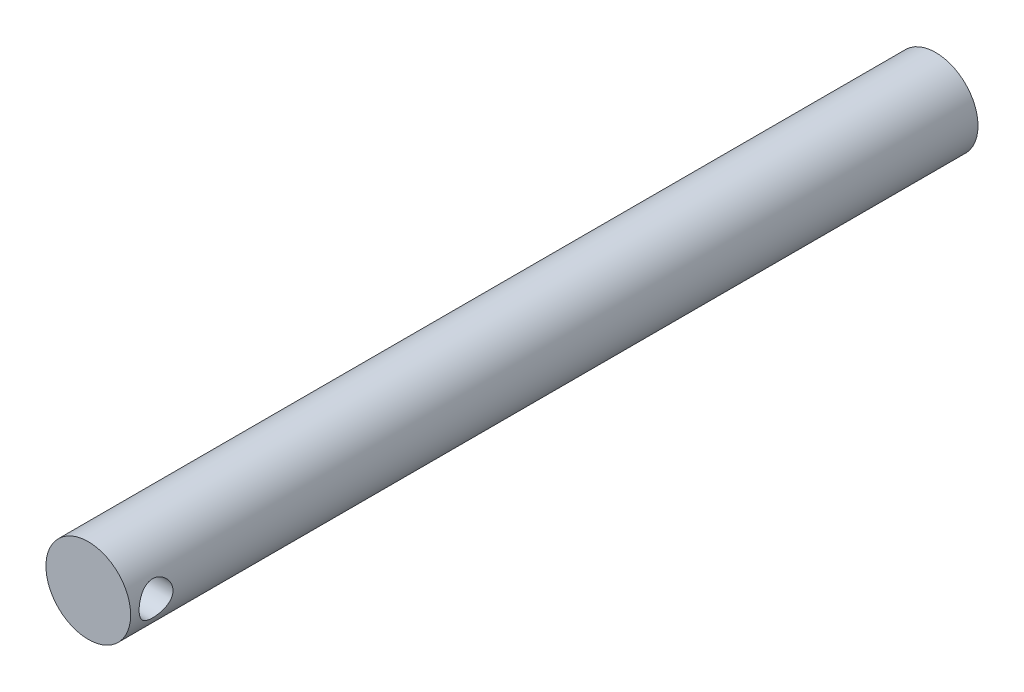
ISO-10303-21;
HEADER;
FILE_DESCRIPTION(('STEP AP214'),'2;1');
FILE_NAME('part.step','',(''),(''),'','','');
FILE_SCHEMA(('AUTOMOTIVE_DESIGN { 1 0 10303 214 1 1 1 1 }'));
ENDSEC;
DATA;
#1=APPLICATION_CONTEXT('core data for automotive mechanical design processes');
#2=APPLICATION_PROTOCOL_DEFINITION('international standard','automotive_design',2000,#1);
#3=PRODUCT_CONTEXT('',#1,'mechanical');
#4=PRODUCT('Part','Part','',(#3));
#5=PRODUCT_RELATED_PRODUCT_CATEGORY('part','',(#4));
#6=PRODUCT_DEFINITION_FORMATION('','',#4);
#7=PRODUCT_DEFINITION_CONTEXT('part definition',#1,'design');
#8=PRODUCT_DEFINITION('design','',#6,#7);
#9=PRODUCT_DEFINITION_SHAPE('','',#8);
#10=(LENGTH_UNIT() NAMED_UNIT(*) SI_UNIT(.MILLI.,.METRE.));
#11=(NAMED_UNIT(*) PLANE_ANGLE_UNIT() SI_UNIT($,.RADIAN.));
#12=(NAMED_UNIT(*) SI_UNIT($,.STERADIAN.) SOLID_ANGLE_UNIT());
#13=UNCERTAINTY_MEASURE_WITH_UNIT(LENGTH_MEASURE(1.E-05),#10,'distance_accuracy_value','');
#14=(GEOMETRIC_REPRESENTATION_CONTEXT(3) GLOBAL_UNCERTAINTY_ASSIGNED_CONTEXT((#13)) GLOBAL_UNIT_ASSIGNED_CONTEXT((#10,
#11,#12)) REPRESENTATION_CONTEXT('',''));
#15=CARTESIAN_POINT('',(0.,0.,0.));
#16=DIRECTION('',(0.,0.,1.));
#17=DIRECTION('',(1.,0.,0.));
#18=AXIS2_PLACEMENT_3D('',#15,#16,#17);
#19=CARTESIAN_POINT('',(0.,0.,50.));
#20=DIRECTION('',(0.,0.,-1.));
#21=DIRECTION('',(-1.,0.,0.));
#22=AXIS2_PLACEMENT_3D('',#19,#20,#21);
#23=CYLINDRICAL_SURFACE('',#22,2.5);
#24=CARTESIAN_POINT('',(-2.5,0.,47.5));
#25=CARTESIAN_POINT('',(-2.49999635613542,0.0537465027214451,47.5000049259119));
#26=CARTESIAN_POINT('',(-2.49824647153466,0.107586282045336,47.5043588760442));
#27=CARTESIAN_POINT('',(-2.49141726550321,0.213748240208947,47.5216238517606));
#28=CARTESIAN_POINT('',(-2.48632889349439,0.266065888780623,47.5345581395431));
#29=CARTESIAN_POINT('',(-2.47337104606559,0.367476961363701,47.5684380390294));
#30=CARTESIAN_POINT('',(-2.46551068182036,0.416580330808481,47.5893574231084));
#31=CARTESIAN_POINT('',(-2.44778305398039,0.510535985164186,47.6385095866633));
#32=CARTESIAN_POINT('',(-2.43791648729028,0.555389738375498,47.6667398274595));
#33=CARTESIAN_POINT('',(-2.41665443085209,0.641750503785198,47.7311177492805));
#34=CARTESIAN_POINT('',(-2.40521148464595,0.683031136275108,47.7675533281201));
#35=CARTESIAN_POINT('',(-2.38230288453097,0.759087502392362,47.8467000017384));
#36=CARTESIAN_POINT('',(-2.37083722226896,0.793860053566767,47.8894141486059));
#37=CARTESIAN_POINT('',(-2.34861395898568,0.85743728364644,47.9822140351211));
#38=CARTESIAN_POINT('',(-2.33791057982476,0.885907490597737,48.0325432430116));
#39=CARTESIAN_POINT('',(-2.31916823593396,0.933877359518574,48.13776819921));
#40=CARTESIAN_POINT('',(-2.31112800622088,0.953381282142916,48.1926617639242));
#41=CARTESIAN_POINT('',(-2.29913178830409,0.981949411697932,48.3028561667961));
#42=CARTESIAN_POINT('',(-2.29500710177802,0.991446982902822,48.3580256177881));
#43=CARTESIAN_POINT('',(-2.29082002024572,1.00108648082001,48.4693174991536));
#44=CARTESIAN_POINT('',(-2.29075562761384,1.00123300815661,48.5254394473125));
#45=CARTESIAN_POINT('',(-2.29455250139997,0.99249468375227,48.632878335729));
#46=CARTESIAN_POINT('',(-2.29814087519225,0.984237657152566,48.6842578572045));
#47=CARTESIAN_POINT('',(-2.30838093803918,0.959973440148907,48.7848297780034));
#48=CARTESIAN_POINT('',(-2.31503316160837,0.943964897402312,48.8340217940552));
#49=CARTESIAN_POINT('',(-2.33079742544265,0.904347366275535,48.930008918098));
#50=CARTESIAN_POINT('',(-2.33995689640394,0.880589931157658,48.9767346195273));
#51=CARTESIAN_POINT('',(-2.35969058194945,0.826253230366107,49.0657079081808));
#52=CARTESIAN_POINT('',(-2.37026532728424,0.795671402550422,49.1079538047014));
#53=CARTESIAN_POINT('',(-2.39263368371135,0.725775299727216,49.190204864401));
#54=CARTESIAN_POINT('',(-2.40445832488076,0.685968731485316,49.229784364723));
#55=CARTESIAN_POINT('',(-2.42729912479141,0.600157213715093,49.301842239001));
#56=CARTESIAN_POINT('',(-2.43831512222662,0.554151032667212,49.3343191987051));
#57=CARTESIAN_POINT('',(-2.45857340632274,0.456038826302915,49.3918087237079));
#58=CARTESIAN_POINT('',(-2.46777635047707,0.403830245673232,49.4166611405985));
#59=CARTESIAN_POINT('',(-2.48307414164379,0.295511882741435,49.457083930539));
#60=CARTESIAN_POINT('',(-2.48917056731191,0.239404098424833,49.4726590187787));
#61=CARTESIAN_POINT('',(-2.49728069753455,0.128447943803907,49.4932241477099));
#62=CARTESIAN_POINT('',(-2.49951472916757,0.0737216469927646,49.4987862271268));
#63=CARTESIAN_POINT('',(-2.50034239255315,-0.0359226549039106,49.5008565502643));
#64=CARTESIAN_POINT('',(-2.49893696791146,-0.0908406066119634,49.4973671407738));
#65=CARTESIAN_POINT('',(-2.49278783531876,-0.196716369560996,49.481854123724));
#66=CARTESIAN_POINT('',(-2.48819695672762,-0.24774124588774,49.4702210098245));
#67=CARTESIAN_POINT('',(-2.4762972070275,-0.347067714030392,49.4392821458451));
#68=CARTESIAN_POINT('',(-2.46898798678265,-0.395368955112423,49.4199754101657));
#69=CARTESIAN_POINT('',(-2.45208297385406,-0.489539392908351,49.37360753016));
#70=CARTESIAN_POINT('',(-2.44242407989902,-0.535289011377704,49.3463272639784));
#71=CARTESIAN_POINT('',(-2.42186682372762,-0.621721795623279,49.2850298380472));
#72=CARTESIAN_POINT('',(-2.41096796555135,-0.662402920380563,49.2510099785387));
#73=CARTESIAN_POINT('',(-2.38822558819056,-0.740361521514408,49.1745649935252));
#74=CARTESIAN_POINT('',(-2.37636720712526,-0.777236966903029,49.1317332292469));
#75=CARTESIAN_POINT('',(-2.35370836458566,-0.843375598706853,49.0402799584953));
#76=CARTESIAN_POINT('',(-2.34290807763255,-0.872637530668753,48.99165749983));
#77=CARTESIAN_POINT('',(-2.32357149953854,-0.922903750965812,48.8892691527029));
#78=CARTESIAN_POINT('',(-2.31505815442394,-0.943825297267224,48.8354580003938));
#79=CARTESIAN_POINT('',(-2.30161836738966,-0.976148109852649,48.7246331741424));
#80=CARTESIAN_POINT('',(-2.29668927847999,-0.987556402634655,48.6676218970938));
#81=CARTESIAN_POINT('',(-2.29135879649963,-0.999857808639198,48.5564360491127));
#82=CARTESIAN_POINT('',(-2.29065710504086,-1.00144854115143,48.5023525802033));
#83=CARTESIAN_POINT('',(-2.29307418016549,-0.995901579638761,48.3947275711434));
#84=CARTESIAN_POINT('',(-2.29619246162397,-0.98876499395689,48.3411859630487));
#85=CARTESIAN_POINT('',(-2.3056332453951,-0.966535683076823,48.2383339050725));
#86=CARTESIAN_POINT('',(-2.31182415913725,-0.951768746785487,48.1889398627835));
#87=CARTESIAN_POINT('',(-2.32662000616348,-0.915002724245505,48.0933106851933));
#88=CARTESIAN_POINT('',(-2.33522560603003,-0.893001640696907,48.0470764265501));
#89=CARTESIAN_POINT('',(-2.35449304802246,-0.840936381379867,47.9561951903646));
#90=CARTESIAN_POINT('',(-2.36524441156621,-0.810482667579747,47.9117906649348));
#91=CARTESIAN_POINT('',(-2.38731902186119,-0.74294605963575,47.8285033413981));
#92=CARTESIAN_POINT('',(-2.39864244024203,-0.705861167409062,47.7896222139358));
#93=CARTESIAN_POINT('',(-2.42146783543697,-0.623252753136232,47.7158985733682));
#94=CARTESIAN_POINT('',(-2.43293378981093,-0.577338000573069,47.681481346551));
#95=CARTESIAN_POINT('',(-2.45400203356858,-0.47995016014289,47.6208314786892));
#96=CARTESIAN_POINT('',(-2.46360345546453,-0.428474502273619,47.5946026439237));
#97=CARTESIAN_POINT('',(-2.47969857407931,-0.322369031247602,47.5516888924049));
#98=CARTESIAN_POINT('',(-2.48624681527514,-0.267815809109847,47.5348353382198));
#99=CARTESIAN_POINT('',(-2.49572153104683,-0.156438273140609,47.5106804395229));
#100=CARTESIAN_POINT('',(-2.49865949747819,-0.0996217629294543,47.5033487816281));
#101=CARTESIAN_POINT('',(-2.49987949752068,-0.0284561489454632,47.5003023095109));
#102=CARTESIAN_POINT('',(-2.50000096484588,-0.0142313443703784,47.4999986956854));
#103=CARTESIAN_POINT('',(-2.5,0.,47.5));
#104=B_SPLINE_CURVE_WITH_KNOTS('',3,(#24,#25,#26,#27,#28,#29,#30,#31,#32,#33,#34,#35,#36,#37,
#38,#39,#40,#41,#42,#43,#44,#45,#46,#47,#48,#49,#50,#51,#52,#53,#54,#55,#56,#57,#58,#59,#60,#61,
#62,#63,#64,#65,#66,#67,#68,#69,#70,#71,#72,#73,#74,#75,#76,#77,#78,#79,#80,#81,#82,#83,#84,#85,
#86,#87,#88,#89,#90,#91,#92,#93,#94,#95,#96,#97,#98,#99,#100,#101,#102,#103),.UNSPECIFIED.,.T.,
.F.,(4,2,2,2,2,2,2,2,2,2,2,2,2,2,2,2,2,2,2,2,2,2,2,2,2,2,2,2,2,2,2,2,2,2,2,2,2,2,2,4),(0.,
0.161201493946534,0.322841818003967,0.483955728735792,0.645013767839921,0.812986908501987,
0.981041974672062,1.15657629409609,1.33202711559134,1.49952052654414,1.66693153170244,
1.82269164200686,1.97847893628023,2.13744563149407,2.29647210969091,2.46779174593278,
2.63914546419866,2.81388456581403,2.98853478056895,3.15284592264003,3.31711446785041,
3.47400227782182,3.63091024496898,3.79261756699131,3.95438979749484,4.12684237312205,
4.29932334521874,4.47347522570412,4.64749836322966,4.80899836696373,4.97047786281521,
5.12557159274383,5.2807081790258,5.44472734028344,5.60879600674195,5.78350211766916,
5.95828931820265,6.12982150506658,6.3008062620217,6.34349022948396),.UNSPECIFIED.);
#105=CARTESIAN_POINT('',(-2.5,0.,47.5));
#106=VERTEX_POINT('',#105);
#107=EDGE_CURVE('E10',#106,#106,#104,.T.);
#108=ORIENTED_EDGE('',*,*,#107,.T.);
#109=EDGE_LOOP('',(#108));
#110=FACE_BOUND('',#109,.T.);
#111=CARTESIAN_POINT('',(2.5,0.,47.5));
#112=CARTESIAN_POINT('',(2.49999635613542,-0.0537465027214451,47.5000049259119));
#113=CARTESIAN_POINT('',(2.49824647153466,-0.107586282045336,47.5043588760442));
#114=CARTESIAN_POINT('',(2.49141726550321,-0.213748240208947,47.5216238517606));
#115=CARTESIAN_POINT('',(2.48632889349439,-0.266065888780623,47.5345581395431));
#116=CARTESIAN_POINT('',(2.47337104606559,-0.367476961363701,47.5684380390294));
#117=CARTESIAN_POINT('',(2.46551068182036,-0.416580330808481,47.5893574231084));
#118=CARTESIAN_POINT('',(2.44778305398039,-0.510535985164186,47.6385095866633));
#119=CARTESIAN_POINT('',(2.43791648729028,-0.555389738375498,47.6667398274595));
#120=CARTESIAN_POINT('',(2.41665443085209,-0.641750503785198,47.7311177492805));
#121=CARTESIAN_POINT('',(2.40521148464595,-0.683031136275108,47.7675533281201));
#122=CARTESIAN_POINT('',(2.38230288453097,-0.759087502392362,47.8467000017384));
#123=CARTESIAN_POINT('',(2.37083722226896,-0.793860053566767,47.8894141486059));
#124=CARTESIAN_POINT('',(2.34861395898568,-0.85743728364644,47.9822140351211));
#125=CARTESIAN_POINT('',(2.33791057982476,-0.885907490597737,48.0325432430116));
#126=CARTESIAN_POINT('',(2.31916823593396,-0.933877359518574,48.13776819921));
#127=CARTESIAN_POINT('',(2.31112800622088,-0.953381282142916,48.1926617639242));
#128=CARTESIAN_POINT('',(2.29913178830409,-0.981949411697932,48.3028561667961));
#129=CARTESIAN_POINT('',(2.29500710177802,-0.991446982902822,48.3580256177881));
#130=CARTESIAN_POINT('',(2.29082002024572,-1.00108648082001,48.4693174991536));
#131=CARTESIAN_POINT('',(2.29075562761384,-1.00123300815661,48.5254394473125));
#132=CARTESIAN_POINT('',(2.29455250139997,-0.99249468375227,48.632878335729));
#133=CARTESIAN_POINT('',(2.29814087519225,-0.984237657152566,48.6842578572045));
#134=CARTESIAN_POINT('',(2.30838093803918,-0.959973440148907,48.7848297780034));
#135=CARTESIAN_POINT('',(2.31503316160837,-0.943964897402312,48.8340217940552));
#136=CARTESIAN_POINT('',(2.33079742544265,-0.904347366275535,48.930008918098));
#137=CARTESIAN_POINT('',(2.33995689640394,-0.880589931157658,48.9767346195273));
#138=CARTESIAN_POINT('',(2.35969058194945,-0.826253230366107,49.0657079081808));
#139=CARTESIAN_POINT('',(2.37026532728424,-0.795671402550422,49.1079538047014));
#140=CARTESIAN_POINT('',(2.39263368371135,-0.725775299727216,49.190204864401));
#141=CARTESIAN_POINT('',(2.40445832488076,-0.685968731485316,49.229784364723));
#142=CARTESIAN_POINT('',(2.42729912479141,-0.600157213715093,49.301842239001));
#143=CARTESIAN_POINT('',(2.43831512222662,-0.554151032667212,49.3343191987051));
#144=CARTESIAN_POINT('',(2.45857340632274,-0.456038826302915,49.3918087237079));
#145=CARTESIAN_POINT('',(2.46777635047707,-0.403830245673232,49.4166611405985));
#146=CARTESIAN_POINT('',(2.48307414164379,-0.295511882741435,49.457083930539));
#147=CARTESIAN_POINT('',(2.48917056731191,-0.239404098424833,49.4726590187787));
#148=CARTESIAN_POINT('',(2.49728069753455,-0.128447943803907,49.4932241477099));
#149=CARTESIAN_POINT('',(2.49951472916757,-0.0737216469927646,49.4987862271268));
#150=CARTESIAN_POINT('',(2.50034239255315,0.0359226549039106,49.5008565502643));
#151=CARTESIAN_POINT('',(2.49893696791146,0.0908406066119634,49.4973671407738));
#152=CARTESIAN_POINT('',(2.49278783531876,0.196716369560996,49.481854123724));
#153=CARTESIAN_POINT('',(2.48819695672762,0.24774124588774,49.4702210098245));
#154=CARTESIAN_POINT('',(2.4762972070275,0.347067714030392,49.4392821458451));
#155=CARTESIAN_POINT('',(2.46898798678265,0.395368955112423,49.4199754101657));
#156=CARTESIAN_POINT('',(2.45208297385406,0.489539392908351,49.37360753016));
#157=CARTESIAN_POINT('',(2.44242407989902,0.535289011377704,49.3463272639784));
#158=CARTESIAN_POINT('',(2.42186682372762,0.621721795623279,49.2850298380472));
#159=CARTESIAN_POINT('',(2.41096796555135,0.662402920380563,49.2510099785387));
#160=CARTESIAN_POINT('',(2.38822558819056,0.740361521514408,49.1745649935252));
#161=CARTESIAN_POINT('',(2.37636720712526,0.777236966903029,49.1317332292469));
#162=CARTESIAN_POINT('',(2.35370836458566,0.843375598706853,49.0402799584953));
#163=CARTESIAN_POINT('',(2.34290807763255,0.872637530668753,48.99165749983));
#164=CARTESIAN_POINT('',(2.32357149953854,0.922903750965812,48.8892691527029));
#165=CARTESIAN_POINT('',(2.31505815442394,0.943825297267224,48.8354580003938));
#166=CARTESIAN_POINT('',(2.30161836738966,0.976148109852649,48.7246331741424));
#167=CARTESIAN_POINT('',(2.29668927847999,0.987556402634655,48.6676218970938));
#168=CARTESIAN_POINT('',(2.29135879649963,0.999857808639198,48.5564360491127));
#169=CARTESIAN_POINT('',(2.29065710504086,1.00144854115143,48.5023525802033));
#170=CARTESIAN_POINT('',(2.29307418016549,0.995901579638761,48.3947275711434));
#171=CARTESIAN_POINT('',(2.29619246162397,0.98876499395689,48.3411859630487));
#172=CARTESIAN_POINT('',(2.3056332453951,0.966535683076823,48.2383339050725));
#173=CARTESIAN_POINT('',(2.31182415913725,0.951768746785487,48.1889398627835));
#174=CARTESIAN_POINT('',(2.32662000616348,0.915002724245505,48.0933106851933));
#175=CARTESIAN_POINT('',(2.33522560603003,0.893001640696907,48.0470764265501));
#176=CARTESIAN_POINT('',(2.35449304802246,0.840936381379867,47.9561951903646));
#177=CARTESIAN_POINT('',(2.36524441156621,0.810482667579747,47.9117906649348));
#178=CARTESIAN_POINT('',(2.38731902186119,0.74294605963575,47.8285033413981));
#179=CARTESIAN_POINT('',(2.39864244024203,0.705861167409062,47.7896222139358));
#180=CARTESIAN_POINT('',(2.42146783543697,0.623252753136232,47.7158985733682));
#181=CARTESIAN_POINT('',(2.43293378981093,0.577338000573069,47.681481346551));
#182=CARTESIAN_POINT('',(2.45400203356858,0.47995016014289,47.6208314786892));
#183=CARTESIAN_POINT('',(2.46360345546453,0.428474502273619,47.5946026439237));
#184=CARTESIAN_POINT('',(2.47969857407931,0.322369031247602,47.5516888924049));
#185=CARTESIAN_POINT('',(2.48624681527514,0.267815809109847,47.5348353382198));
#186=CARTESIAN_POINT('',(2.49572153104683,0.156438273140609,47.5106804395229));
#187=CARTESIAN_POINT('',(2.49865949747819,0.0996217629294543,47.5033487816281));
#188=CARTESIAN_POINT('',(2.49987949752068,0.0284561489454632,47.5003023095109));
#189=CARTESIAN_POINT('',(2.50000096484588,0.0142313443703784,47.4999986956854));
#190=CARTESIAN_POINT('',(2.5,0.,47.5));
#191=B_SPLINE_CURVE_WITH_KNOTS('',3,(#111,#112,#113,#114,#115,#116,#117,#118,#119,#120,#121,
#122,#123,#124,#125,#126,#127,#128,#129,#130,#131,#132,#133,#134,#135,#136,#137,#138,#139,#140,
#141,#142,#143,#144,#145,#146,#147,#148,#149,#150,#151,#152,#153,#154,#155,#156,#157,#158,#159,
#160,#161,#162,#163,#164,#165,#166,#167,#168,#169,#170,#171,#172,#173,#174,#175,#176,#177,#178,
#179,#180,#181,#182,#183,#184,#185,#186,#187,#188,#189,#190),.UNSPECIFIED.,.T.,.F.,(4,2,2,2,2,2,
2,2,2,2,2,2,2,2,2,2,2,2,2,2,2,2,2,2,2,2,2,2,2,2,2,2,2,2,2,2,2,2,2,4),(0.,0.161201493946534,
0.322841818003967,0.483955728735792,0.645013767839921,0.812986908501987,0.981041974672062,
1.15657629409609,1.33202711559134,1.49952052654414,1.66693153170244,1.82269164200686,
1.97847893628023,2.13744563149407,2.29647210969091,2.46779174593278,2.63914546419866,
2.81388456581403,2.98853478056895,3.15284592264003,3.31711446785041,3.47400227782182,
3.63091024496898,3.79261756699131,3.95438979749484,4.12684237312205,4.29932334521874,
4.47347522570412,4.64749836322966,4.80899836696373,4.97047786281521,5.12557159274383,
5.2807081790258,5.44472734028344,5.60879600674195,5.78350211766916,5.95828931820265,
6.12982150506658,6.3008062620217,6.34349022948396),.UNSPECIFIED.);
#192=CARTESIAN_POINT('',(2.5,0.,47.5));
#193=VERTEX_POINT('',#192);
#194=EDGE_CURVE('E54',#193,#193,#191,.T.);
#195=ORIENTED_EDGE('',*,*,#194,.T.);
#196=EDGE_LOOP('',(#195));
#197=FACE_BOUND('',#196,.T.);
#198=CARTESIAN_POINT('',(0.,0.,50.));
#199=DIRECTION('',(0.,0.,1.));
#200=DIRECTION('',(1.,0.,0.));
#201=AXIS2_PLACEMENT_3D('',#198,#199,#200);
#202=CIRCLE('',#201,2.5);
#203=CARTESIAN_POINT('',(2.5,0.,50.));
#204=VERTEX_POINT('',#203);
#205=EDGE_CURVE('E59',#204,#204,#202,.T.);
#206=ORIENTED_EDGE('',*,*,#205,.F.);
#207=EDGE_LOOP('',(#206));
#208=FACE_BOUND('',#207,.T.);
#209=CARTESIAN_POINT('',(0.,0.,0.));
#210=DIRECTION('',(0.,0.,1.));
#211=DIRECTION('',(1.,0.,0.));
#212=AXIS2_PLACEMENT_3D('',#209,#210,#211);
#213=CIRCLE('',#212,2.5);
#214=CARTESIAN_POINT('',(2.5,0.,0.));
#215=VERTEX_POINT('',#214);
#216=EDGE_CURVE('E64',#215,#215,#213,.T.);
#217=ORIENTED_EDGE('',*,*,#216,.T.);
#218=EDGE_LOOP('',(#217));
#219=FACE_BOUND('',#218,.T.);
#220=ADVANCED_FACE('F42',(#110,#197,#208,#219),#23,.T.);
#221=CARTESIAN_POINT('',(0.,0.,50.));
#222=DIRECTION('',(0.,0.,1.));
#223=DIRECTION('',(1.,0.,0.));
#224=AXIS2_PLACEMENT_3D('',#221,#222,#223);
#225=PLANE('',#224);
#226=ORIENTED_EDGE('',*,*,#205,.T.);
#227=EDGE_LOOP('',(#226));
#228=FACE_BOUND('',#227,.T.);
#229=ADVANCED_FACE('F76',(#228),#225,.T.);
#230=CARTESIAN_POINT('',(0.,0.,0.));
#231=DIRECTION('',(0.,0.,1.));
#232=DIRECTION('',(1.,0.,0.));
#233=AXIS2_PLACEMENT_3D('',#230,#231,#232);
#234=PLANE('',#233);
#235=ORIENTED_EDGE('',*,*,#216,.F.);
#236=EDGE_LOOP('',(#235));
#237=FACE_BOUND('',#236,.T.);
#238=ADVANCED_FACE('F74',(#237),#234,.F.);
#239=CARTESIAN_POINT('',(-2.5,0.,48.5));
#240=DIRECTION('',(1.,0.,0.));
#241=DIRECTION('',(0.,0.,-1.));
#242=AXIS2_PLACEMENT_3D('',#239,#240,#241);
#243=CYLINDRICAL_SURFACE('',#242,0.999999999999998);
#244=ORIENTED_EDGE('',*,*,#194,.F.);
#245=EDGE_LOOP('',(#244));
#246=FACE_BOUND('',#245,.T.);
#247=ORIENTED_EDGE('',*,*,#107,.F.);
#248=EDGE_LOOP('',(#247));
#249=FACE_BOUND('',#248,.T.);
#250=ADVANCED_FACE('F70',(#246,#249),#243,.F.);
#251=CLOSED_SHELL('',(#220,#229,#238,#250));
#252=MANIFOLD_SOLID_BREP('B2',#251);
#253=ADVANCED_BREP_SHAPE_REPRESENTATION('',(#18,#252),#14);
#254=SHAPE_DEFINITION_REPRESENTATION(#9,#253);
ENDSEC;
END-ISO-10303-21;
